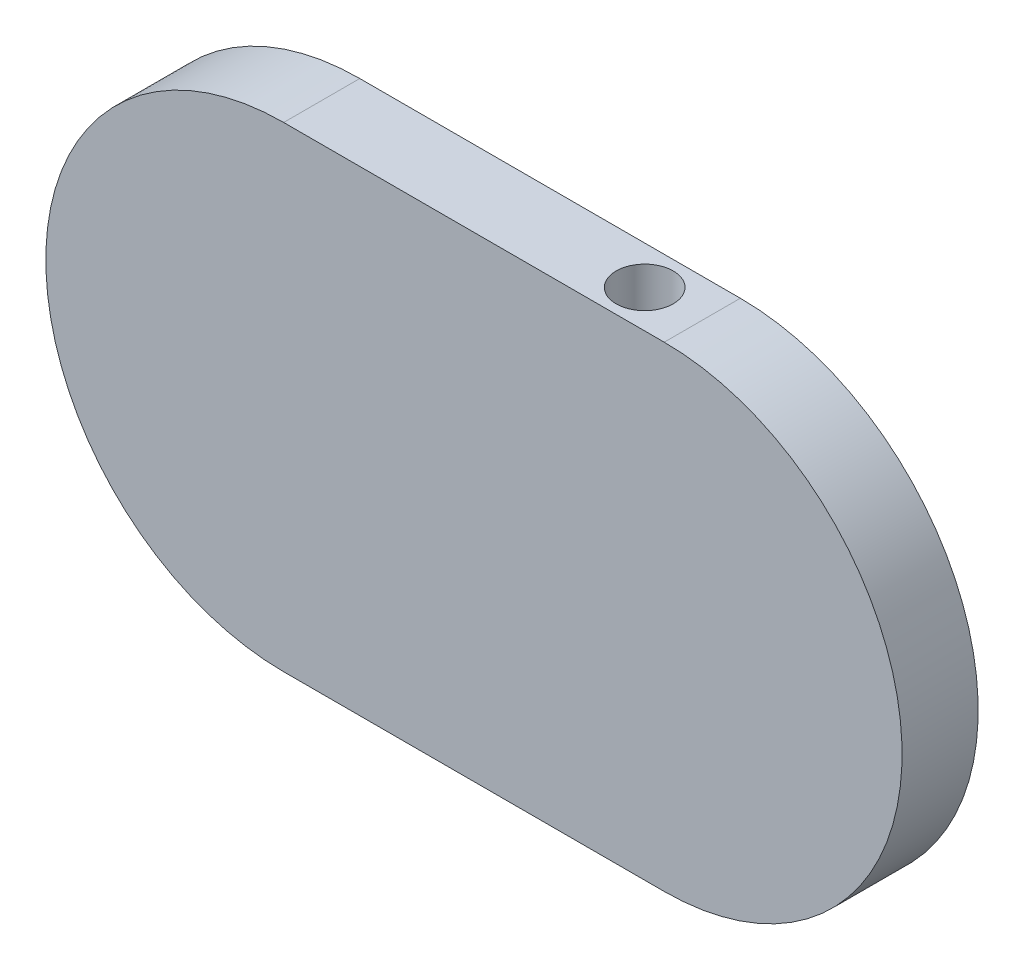
ISO-10303-21;
HEADER;
FILE_DESCRIPTION(('STEP AP214'),'2;1');
FILE_NAME('part.step','',(''),(''),'','','');
FILE_SCHEMA(('AUTOMOTIVE_DESIGN { 1 0 10303 214 1 1 1 1 }'));
ENDSEC;
DATA;
#1=APPLICATION_CONTEXT('core data for automotive mechanical design processes');
#2=APPLICATION_PROTOCOL_DEFINITION('international standard','automotive_design',2000,#1);
#3=PRODUCT_CONTEXT('',#1,'mechanical');
#4=PRODUCT('Part','Part','',(#3));
#5=PRODUCT_RELATED_PRODUCT_CATEGORY('part','',(#4));
#6=PRODUCT_DEFINITION_FORMATION('','',#4);
#7=PRODUCT_DEFINITION_CONTEXT('part definition',#1,'design');
#8=PRODUCT_DEFINITION('design','',#6,#7);
#9=PRODUCT_DEFINITION_SHAPE('','',#8);
#10=(LENGTH_UNIT() NAMED_UNIT(*) SI_UNIT(.MILLI.,.METRE.));
#11=(NAMED_UNIT(*) PLANE_ANGLE_UNIT() SI_UNIT($,.RADIAN.));
#12=(NAMED_UNIT(*) SI_UNIT($,.STERADIAN.) SOLID_ANGLE_UNIT());
#13=UNCERTAINTY_MEASURE_WITH_UNIT(LENGTH_MEASURE(1.E-05),#10,'distance_accuracy_value','');
#14=(GEOMETRIC_REPRESENTATION_CONTEXT(3) GLOBAL_UNCERTAINTY_ASSIGNED_CONTEXT((#13)) GLOBAL_UNIT_ASSIGNED_CONTEXT((#10,
#11,#12)) REPRESENTATION_CONTEXT('',''));
#15=CARTESIAN_POINT('',(0.,0.,0.));
#16=DIRECTION('',(0.,0.,1.));
#17=DIRECTION('',(1.,0.,0.));
#18=AXIS2_PLACEMENT_3D('',#15,#16,#17);
#19=CARTESIAN_POINT('',(-37.300835355,0.,80.));
#20=DIRECTION('',(0.,0.,-1.));
#21=DIRECTION('',(-1.,0.,0.));
#22=AXIS2_PLACEMENT_3D('',#19,#20,#21);
#23=CYLINDRICAL_SURFACE('',#22,250.);
#24=CARTESIAN_POINT('',(-37.300835355,0.,0.));
#25=DIRECTION('',(0.,0.,1.));
#26=DIRECTION('',(1.,0.,0.));
#27=AXIS2_PLACEMENT_3D('',#24,#25,#26);
#28=CIRCLE('',#27,250.);
#29=CARTESIAN_POINT('',(-37.300835355,250.,0.));
#30=VERTEX_POINT('',#29);
#31=CARTESIAN_POINT('',(-37.300835355,-250.,0.));
#32=VERTEX_POINT('',#31);
#33=EDGE_CURVE('E101',#30,#32,#28,.T.);
#34=ORIENTED_EDGE('',*,*,#33,.T.);
#35=DIRECTION('',(0.,0.,-1.));
#36=VECTOR('',#35,1.);
#37=CARTESIAN_POINT('',(-37.300835355,-250.,80.));
#38=LINE('',#37,#36);
#39=CARTESIAN_POINT('',(-37.300835355,-250.,80.));
#40=VERTEX_POINT('',#39);
#41=EDGE_CURVE('E92',#40,#32,#38,.T.);
#42=ORIENTED_EDGE('',*,*,#41,.F.);
#43=CARTESIAN_POINT('',(-37.300835355,0.,80.));
#44=DIRECTION('',(0.,0.,1.));
#45=DIRECTION('',(1.,0.,0.));
#46=AXIS2_PLACEMENT_3D('',#43,#44,#45);
#47=CIRCLE('',#46,250.);
#48=CARTESIAN_POINT('',(-37.300835355,250.,80.));
#49=VERTEX_POINT('',#48);
#50=EDGE_CURVE('E86',#49,#40,#47,.T.);
#51=ORIENTED_EDGE('',*,*,#50,.F.);
#52=DIRECTION('',(0.,0.,-1.));
#53=VECTOR('',#52,1.);
#54=CARTESIAN_POINT('',(-37.300835355,250.,80.));
#55=LINE('',#54,#53);
#56=EDGE_CURVE('E97',#49,#30,#55,.T.);
#57=ORIENTED_EDGE('',*,*,#56,.T.);
#58=EDGE_LOOP('',(#34,#42,#51,#57));
#59=FACE_BOUND('',#58,.T.);
#60=ADVANCED_FACE('F33',(#59),#23,.T.);
#61=CARTESIAN_POINT('',(-37.300835355,-250.,80.));
#62=DIRECTION('',(0.,1.,0.));
#63=DIRECTION('',(0.,0.,1.));
#64=AXIS2_PLACEMENT_3D('',#61,#62,#63);
#65=PLANE('',#64);
#66=CARTESIAN_POINT('',(302.549396617586,-250.,40.409285440342));
#67=DIRECTION('',(0.,1.,0.));
#68=DIRECTION('',(0.,0.,1.));
#69=AXIS2_PLACEMENT_3D('',#66,#67,#68);
#70=CIRCLE('',#69,30.);
#71=CARTESIAN_POINT('',(302.549396617586,-250.,70.409285440342));
#72=VERTEX_POINT('',#71);
#73=EDGE_CURVE('E104',#72,#72,#70,.T.);
#74=ORIENTED_EDGE('',*,*,#73,.T.);
#75=EDGE_LOOP('',(#74));
#76=FACE_BOUND('',#75,.T.);
#77=DIRECTION('',(1.,0.,0.));
#78=VECTOR('',#77,1.);
#79=CARTESIAN_POINT('',(-37.300835355,-250.,0.));
#80=LINE('',#79,#78);
#81=CARTESIAN_POINT('',(362.699164645,-250.,0.));
#82=VERTEX_POINT('',#81);
#83=EDGE_CURVE('E91',#32,#82,#80,.T.);
#84=ORIENTED_EDGE('',*,*,#83,.T.);
#85=DIRECTION('',(0.,0.,-1.));
#86=VECTOR('',#85,1.);
#87=CARTESIAN_POINT('',(362.699164645,-250.,80.));
#88=LINE('',#87,#86);
#89=CARTESIAN_POINT('',(362.699164645,-250.,80.));
#90=VERTEX_POINT('',#89);
#91=EDGE_CURVE('E89',#90,#82,#88,.T.);
#92=ORIENTED_EDGE('',*,*,#91,.F.);
#93=DIRECTION('',(1.,0.,0.));
#94=VECTOR('',#93,1.);
#95=CARTESIAN_POINT('',(-37.300835355,-250.,80.));
#96=LINE('',#95,#94);
#97=EDGE_CURVE('E81',#40,#90,#96,.T.);
#98=ORIENTED_EDGE('',*,*,#97,.F.);
#99=ORIENTED_EDGE('',*,*,#41,.T.);
#100=EDGE_LOOP('',(#84,#92,#98,#99));
#101=FACE_BOUND('',#100,.T.);
#102=ADVANCED_FACE('F90',(#76,#101),#65,.F.);
#103=CARTESIAN_POINT('',(362.699164645,0.,80.));
#104=DIRECTION('',(0.,0.,-1.));
#105=DIRECTION('',(-1.,0.,0.));
#106=AXIS2_PLACEMENT_3D('',#103,#104,#105);
#107=CYLINDRICAL_SURFACE('',#106,250.);
#108=CARTESIAN_POINT('',(362.699164645,0.,0.));
#109=DIRECTION('',(0.,0.,1.));
#110=DIRECTION('',(1.,0.,0.));
#111=AXIS2_PLACEMENT_3D('',#108,#109,#110);
#112=CIRCLE('',#111,250.);
#113=CARTESIAN_POINT('',(362.699164645,250.,0.));
#114=VERTEX_POINT('',#113);
#115=EDGE_CURVE('E67',#82,#114,#112,.T.);
#116=ORIENTED_EDGE('',*,*,#115,.T.);
#117=DIRECTION('',(0.,0.,-1.));
#118=VECTOR('',#117,1.);
#119=CARTESIAN_POINT('',(362.699164645,250.,80.));
#120=LINE('',#119,#118);
#121=CARTESIAN_POINT('',(362.699164645,250.,80.));
#122=VERTEX_POINT('',#121);
#123=EDGE_CURVE('E93',#122,#114,#120,.T.);
#124=ORIENTED_EDGE('',*,*,#123,.F.);
#125=CARTESIAN_POINT('',(362.699164645,0.,80.));
#126=DIRECTION('',(0.,0.,1.));
#127=DIRECTION('',(1.,0.,0.));
#128=AXIS2_PLACEMENT_3D('',#125,#126,#127);
#129=CIRCLE('',#128,250.);
#130=EDGE_CURVE('E84',#90,#122,#129,.T.);
#131=ORIENTED_EDGE('',*,*,#130,.F.);
#132=ORIENTED_EDGE('',*,*,#91,.T.);
#133=EDGE_LOOP('',(#116,#124,#131,#132));
#134=FACE_BOUND('',#133,.T.);
#135=ADVANCED_FACE('F95',(#134),#107,.T.);
#136=CARTESIAN_POINT('',(-37.300835355,250.,80.));
#137=DIRECTION('',(0.,-1.,0.));
#138=DIRECTION('',(0.,0.,-1.));
#139=AXIS2_PLACEMENT_3D('',#136,#137,#138);
#140=PLANE('',#139);
#141=CARTESIAN_POINT('',(302.549396617586,250.,40.409285440342));
#142=DIRECTION('',(0.,1.,0.));
#143=DIRECTION('',(0.,0.,1.));
#144=AXIS2_PLACEMENT_3D('',#141,#142,#143);
#145=CIRCLE('',#144,30.);
#146=CARTESIAN_POINT('',(302.549396617586,250.,70.409285440342));
#147=VERTEX_POINT('',#146);
#148=EDGE_CURVE('E144',#147,#147,#145,.T.);
#149=ORIENTED_EDGE('',*,*,#148,.F.);
#150=EDGE_LOOP('',(#149));
#151=FACE_BOUND('',#150,.T.);
#152=DIRECTION('',(-1.,0.,0.));
#153=VECTOR('',#152,1.);
#154=CARTESIAN_POINT('',(-37.300835355,250.,0.));
#155=LINE('',#154,#153);
#156=EDGE_CURVE('E73',#114,#30,#155,.T.);
#157=ORIENTED_EDGE('',*,*,#156,.T.);
#158=ORIENTED_EDGE('',*,*,#56,.F.);
#159=DIRECTION('',(-1.,0.,0.));
#160=VECTOR('',#159,1.);
#161=CARTESIAN_POINT('',(-37.300835355,250.,80.));
#162=LINE('',#161,#160);
#163=EDGE_CURVE('E50',#122,#49,#162,.T.);
#164=ORIENTED_EDGE('',*,*,#163,.F.);
#165=ORIENTED_EDGE('',*,*,#123,.T.);
#166=EDGE_LOOP('',(#157,#158,#164,#165));
#167=FACE_BOUND('',#166,.T.);
#168=ADVANCED_FACE('F122',(#151,#167),#140,.F.);
#169=CARTESIAN_POINT('',(-37.300835355,0.,80.));
#170=DIRECTION('',(0.,0.,1.));
#171=DIRECTION('',(1.,0.,0.));
#172=AXIS2_PLACEMENT_3D('',#169,#170,#171);
#173=PLANE('',#172);
#174=ORIENTED_EDGE('',*,*,#50,.T.);
#175=ORIENTED_EDGE('',*,*,#97,.T.);
#176=ORIENTED_EDGE('',*,*,#130,.T.);
#177=ORIENTED_EDGE('',*,*,#163,.T.);
#178=EDGE_LOOP('',(#174,#175,#176,#177));
#179=FACE_BOUND('',#178,.T.);
#180=ADVANCED_FACE('F82',(#179),#173,.T.);
#181=CARTESIAN_POINT('',(-37.300835355,0.,0.));
#182=DIRECTION('',(0.,0.,1.));
#183=DIRECTION('',(1.,0.,0.));
#184=AXIS2_PLACEMENT_3D('',#181,#182,#183);
#185=PLANE('',#184);
#186=CARTESIAN_POINT('',(-125.244285171021,0.,0.));
#187=DIRECTION('',(0.,0.,1.));
#188=DIRECTION('',(1.,0.,0.));
#189=AXIS2_PLACEMENT_3D('',#186,#187,#188);
#190=CIRCLE('',#189,97.);
#191=CARTESIAN_POINT('',(-28.2442851710215,0.,0.));
#192=VERTEX_POINT('',#191);
#193=EDGE_CURVE('E42',#192,#192,#190,.F.);
#194=ORIENTED_EDGE('',*,*,#193,.F.);
#195=EDGE_LOOP('',(#194));
#196=FACE_BOUND('',#195,.T.);
#197=ORIENTED_EDGE('',*,*,#33,.F.);
#198=ORIENTED_EDGE('',*,*,#156,.F.);
#199=ORIENTED_EDGE('',*,*,#115,.F.);
#200=ORIENTED_EDGE('',*,*,#83,.F.);
#201=EDGE_LOOP('',(#197,#198,#199,#200));
#202=FACE_BOUND('',#201,.T.);
#203=ADVANCED_FACE('F115',(#196,#202),#185,.F.);
#204=CARTESIAN_POINT('',(302.549396617586,-250.,40.409285440342));
#205=DIRECTION('',(0.,1.,0.));
#206=DIRECTION('',(0.,0.,1.));
#207=AXIS2_PLACEMENT_3D('',#204,#205,#206);
#208=CYLINDRICAL_SURFACE('',#207,30.);
#209=ORIENTED_EDGE('',*,*,#73,.F.);
#210=EDGE_LOOP('',(#209));
#211=FACE_BOUND('',#210,.T.);
#212=ORIENTED_EDGE('',*,*,#148,.T.);
#213=EDGE_LOOP('',(#212));
#214=FACE_BOUND('',#213,.T.);
#215=ADVANCED_FACE('F118',(#211,#214),#208,.F.);
#216=CARTESIAN_POINT('',(-125.244285171021,0.,-80.));
#217=DIRECTION('',(0.,0.,-1.));
#218=DIRECTION('',(-1.,0.,0.));
#219=AXIS2_PLACEMENT_3D('',#216,#217,#218);
#220=PLANE('',#219);
#221=CARTESIAN_POINT('',(-125.244285171021,0.,-80.));
#222=DIRECTION('',(0.,0.,-1.));
#223=DIRECTION('',(-1.,0.,0.));
#224=AXIS2_PLACEMENT_3D('',#221,#222,#223);
#225=CIRCLE('',#224,15.8877321239259);
#226=CARTESIAN_POINT('',(-141.132017294947,0.,-80.));
#227=VERTEX_POINT('',#226);
#228=EDGE_CURVE('E11',#227,#227,#225,.T.);
#229=ORIENTED_EDGE('',*,*,#228,.T.);
#230=EDGE_LOOP('',(#229));
#231=FACE_BOUND('',#230,.T.);
#232=ADVANCED_FACE('F150',(#231),#220,.T.);
#233=CARTESIAN_POINT('',(-125.244285171021,0.,1.12000000000001));
#234=DIRECTION('',(0.,0.,1.));
#235=DIRECTION('',(1.,0.,0.));
#236=AXIS2_PLACEMENT_3D('',#233,#234,#235);
#237=DEGENERATE_TOROIDAL_SURFACE('',#236,15.8877321239259,81.12,.T.);
#238=ORIENTED_EDGE('',*,*,#193,.T.);
#239=EDGE_LOOP('',(#238));
#240=FACE_BOUND('',#239,.T.);
#241=ORIENTED_EDGE('',*,*,#228,.F.);
#242=EDGE_LOOP('',(#241));
#243=FACE_BOUND('',#242,.T.);
#244=ADVANCED_FACE('F35',(#240,#243),#237,.T.);
#245=CLOSED_SHELL('',(#60,#102,#135,#168,#180,#203,#215,#232,#244));
#246=MANIFOLD_SOLID_BREP('B2',#245);
#247=ADVANCED_BREP_SHAPE_REPRESENTATION('',(#18,#246),#14);
#248=SHAPE_DEFINITION_REPRESENTATION(#9,#247);
ENDSEC;
END-ISO-10303-21;
